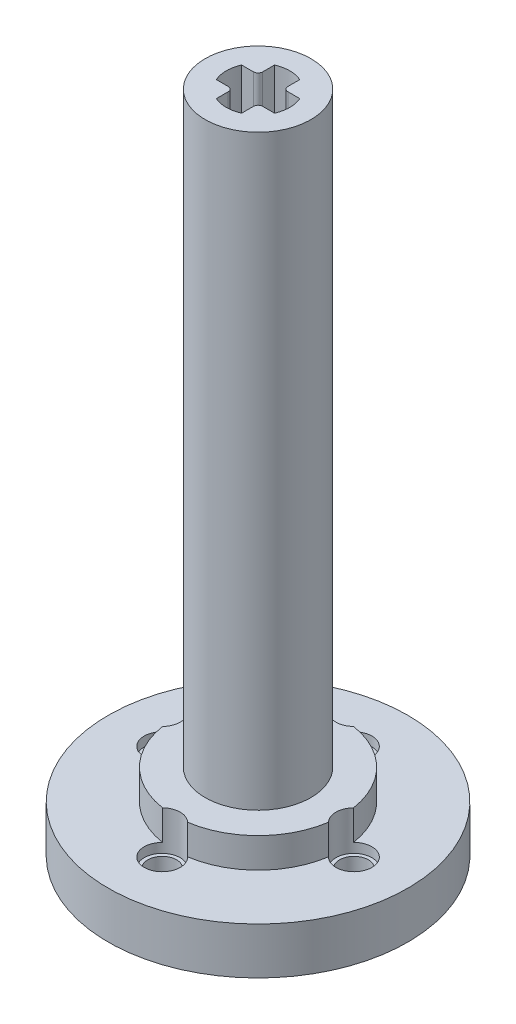
ISO-10303-21;
HEADER;
FILE_DESCRIPTION(('STEP AP214'),'2;1');
FILE_NAME('part.step','',(''),(''),'','','');
FILE_SCHEMA(('AUTOMOTIVE_DESIGN { 1 0 10303 214 1 1 1 1 }'));
ENDSEC;
DATA;
#1=APPLICATION_CONTEXT('core data for automotive mechanical design processes');
#2=APPLICATION_PROTOCOL_DEFINITION('international standard','automotive_design',2000,#1);
#3=PRODUCT_CONTEXT('',#1,'mechanical');
#4=PRODUCT('Part','Part','',(#3));
#5=PRODUCT_RELATED_PRODUCT_CATEGORY('part','',(#4));
#6=PRODUCT_DEFINITION_FORMATION('','',#4);
#7=PRODUCT_DEFINITION_CONTEXT('part definition',#1,'design');
#8=PRODUCT_DEFINITION('design','',#6,#7);
#9=PRODUCT_DEFINITION_SHAPE('','',#8);
#10=(LENGTH_UNIT() NAMED_UNIT(*) SI_UNIT(.MILLI.,.METRE.));
#11=(NAMED_UNIT(*) PLANE_ANGLE_UNIT() SI_UNIT($,.RADIAN.));
#12=(NAMED_UNIT(*) SI_UNIT($,.STERADIAN.) SOLID_ANGLE_UNIT());
#13=UNCERTAINTY_MEASURE_WITH_UNIT(LENGTH_MEASURE(1.E-05),#10,'distance_accuracy_value','');
#14=(GEOMETRIC_REPRESENTATION_CONTEXT(3) GLOBAL_UNCERTAINTY_ASSIGNED_CONTEXT((#13)) GLOBAL_UNIT_ASSIGNED_CONTEXT((#10,
#11,#12)) REPRESENTATION_CONTEXT('',''));
#15=CARTESIAN_POINT('',(0.,0.,0.));
#16=DIRECTION('',(0.,0.,1.));
#17=DIRECTION('',(1.,0.,0.));
#18=AXIS2_PLACEMENT_3D('',#15,#16,#17);
#19=CARTESIAN_POINT('',(0.,0.,0.));
#20=DIRECTION('',(0.,-1.,0.));
#21=DIRECTION('',(0.,0.,-1.));
#22=AXIS2_PLACEMENT_3D('',#19,#20,#21);
#23=CYLINDRICAL_SURFACE('',#22,7.);
#24=CARTESIAN_POINT('',(0.,3.9,0.));
#25=DIRECTION('',(0.,-1.,0.));
#26=DIRECTION('',(0.,0.,-1.));
#27=AXIS2_PLACEMENT_3D('',#24,#25,#26);
#28=CIRCLE('',#27,7.);
#29=CARTESIAN_POINT('',(1.04290291224783,3.9,-6.921875));
#30=VERTEX_POINT('',#29);
#31=CARTESIAN_POINT('',(6.921875,3.9,-1.04290291224782));
#32=VERTEX_POINT('',#31);
#33=EDGE_CURVE('E238',#30,#32,#28,.T.);
#34=ORIENTED_EDGE('',*,*,#33,.F.);
#35=DIRECTION('',(0.,-1.,0.));
#36=VECTOR('',#35,1.);
#37=CARTESIAN_POINT('',(1.04290291224783,4.753125,-6.921875));
#38=LINE('',#37,#36);
#39=CARTESIAN_POINT('',(1.04290291224783,6.4,-6.921875));
#40=VERTEX_POINT('',#39);
#41=EDGE_CURVE('E322',#30,#40,#38,.F.);
#42=ORIENTED_EDGE('',*,*,#41,.T.);
#43=CARTESIAN_POINT('',(0.,6.4,0.));
#44=DIRECTION('',(0.,-1.,0.));
#45=DIRECTION('',(0.,0.,-1.));
#46=AXIS2_PLACEMENT_3D('',#43,#44,#45);
#47=CIRCLE('',#46,7.);
#48=CARTESIAN_POINT('',(6.921875,6.4,-1.04290291224782));
#49=VERTEX_POINT('',#48);
#50=EDGE_CURVE('E228',#40,#49,#47,.T.);
#51=ORIENTED_EDGE('',*,*,#50,.T.);
#52=DIRECTION('',(0.,-1.,0.));
#53=VECTOR('',#52,1.);
#54=CARTESIAN_POINT('',(6.921875,4.753125,-1.04290291224782));
#55=LINE('',#54,#53);
#56=EDGE_CURVE('E205',#49,#32,#55,.T.);
#57=ORIENTED_EDGE('',*,*,#56,.T.);
#58=EDGE_LOOP('',(#34,#42,#51,#57));
#59=FACE_BOUND('',#58,.T.);
#60=ADVANCED_FACE('F39',(#59),#23,.T.);
#61=CARTESIAN_POINT('',(-6.921875,6.4,-1.04290291224782));
#62=VERTEX_POINT('',#61);
#63=CARTESIAN_POINT('',(-1.04290291224783,6.4,-6.921875));
#64=VERTEX_POINT('',#63);
#65=EDGE_CURVE('E232',#62,#64,#47,.T.);
#66=ORIENTED_EDGE('',*,*,#65,.T.);
#67=DIRECTION('',(0.,-1.,0.));
#68=VECTOR('',#67,1.);
#69=CARTESIAN_POINT('',(-1.04290291224783,4.753125,-6.921875));
#70=LINE('',#69,#68);
#71=CARTESIAN_POINT('',(-1.04290291224783,3.9,-6.921875));
#72=VERTEX_POINT('',#71);
#73=EDGE_CURVE('E54',#64,#72,#70,.T.);
#74=ORIENTED_EDGE('',*,*,#73,.T.);
#75=CARTESIAN_POINT('',(-6.921875,3.9,-1.04290291224782));
#76=VERTEX_POINT('',#75);
#77=EDGE_CURVE('E231',#76,#72,#28,.T.);
#78=ORIENTED_EDGE('',*,*,#77,.F.);
#79=DIRECTION('',(0.,-1.,0.));
#80=VECTOR('',#79,1.);
#81=CARTESIAN_POINT('',(-6.921875,4.753125,-1.04290291224782));
#82=LINE('',#81,#80);
#83=EDGE_CURVE('E316',#76,#62,#82,.F.);
#84=ORIENTED_EDGE('',*,*,#83,.T.);
#85=EDGE_LOOP('',(#66,#74,#78,#84));
#86=FACE_BOUND('',#85,.T.);
#87=ADVANCED_FACE('F263',(#86),#23,.T.);
#88=CARTESIAN_POINT('',(-1.04290291224783,6.4,6.921875));
#89=VERTEX_POINT('',#88);
#90=CARTESIAN_POINT('',(-6.921875,6.4,1.04290291224782));
#91=VERTEX_POINT('',#90);
#92=EDGE_CURVE('E229',#89,#91,#47,.T.);
#93=ORIENTED_EDGE('',*,*,#92,.T.);
#94=DIRECTION('',(0.,-1.,0.));
#95=VECTOR('',#94,1.);
#96=CARTESIAN_POINT('',(-6.921875,4.753125,1.04290291224783));
#97=LINE('',#96,#95);
#98=CARTESIAN_POINT('',(-6.921875,3.9,1.04290291224783));
#99=VERTEX_POINT('',#98);
#100=EDGE_CURVE('E61',#91,#99,#97,.T.);
#101=ORIENTED_EDGE('',*,*,#100,.T.);
#102=CARTESIAN_POINT('',(-1.04290291224783,3.9,6.921875));
#103=VERTEX_POINT('',#102);
#104=EDGE_CURVE('E460',#103,#99,#28,.T.);
#105=ORIENTED_EDGE('',*,*,#104,.F.);
#106=DIRECTION('',(0.,-1.,0.));
#107=VECTOR('',#106,1.);
#108=CARTESIAN_POINT('',(-1.04290291224783,4.753125,6.921875));
#109=LINE('',#108,#107);
#110=EDGE_CURVE('E286',#103,#89,#109,.F.);
#111=ORIENTED_EDGE('',*,*,#110,.T.);
#112=EDGE_LOOP('',(#93,#101,#105,#111));
#113=FACE_BOUND('',#112,.T.);
#114=ADVANCED_FACE('F270',(#113),#23,.T.);
#115=CARTESIAN_POINT('',(6.921875,6.4,1.04290291224783));
#116=VERTEX_POINT('',#115);
#117=CARTESIAN_POINT('',(1.04290291224783,6.4,6.921875));
#118=VERTEX_POINT('',#117);
#119=EDGE_CURVE('E218',#116,#118,#47,.T.);
#120=ORIENTED_EDGE('',*,*,#119,.T.);
#121=DIRECTION('',(0.,-1.,0.));
#122=VECTOR('',#121,1.);
#123=CARTESIAN_POINT('',(1.04290291224783,4.753125,6.921875));
#124=LINE('',#123,#122);
#125=CARTESIAN_POINT('',(1.04290291224783,3.9,6.921875));
#126=VERTEX_POINT('',#125);
#127=EDGE_CURVE('E221',#118,#126,#124,.T.);
#128=ORIENTED_EDGE('',*,*,#127,.T.);
#129=CARTESIAN_POINT('',(6.921875,3.9,1.04290291224782));
#130=VERTEX_POINT('',#129);
#131=EDGE_CURVE('E220',#130,#126,#28,.T.);
#132=ORIENTED_EDGE('',*,*,#131,.F.);
#133=DIRECTION('',(0.,-1.,0.));
#134=VECTOR('',#133,1.);
#135=CARTESIAN_POINT('',(6.921875,4.753125,1.04290291224783));
#136=LINE('',#135,#134);
#137=EDGE_CURVE('E202',#130,#116,#136,.F.);
#138=ORIENTED_EDGE('',*,*,#137,.T.);
#139=EDGE_LOOP('',(#120,#128,#132,#138));
#140=FACE_BOUND('',#139,.T.);
#141=ADVANCED_FACE('F216',(#140),#23,.T.);
#142=CARTESIAN_POINT('',(0.,0.,0.));
#143=DIRECTION('',(0.,-1.,0.));
#144=DIRECTION('',(0.,0.,-1.));
#145=AXIS2_PLACEMENT_3D('',#142,#143,#144);
#146=PLANE('',#145);
#147=CARTESIAN_POINT('',(8.,0.,0.));
#148=DIRECTION('',(0.,-1.,0.));
#149=DIRECTION('',(0.,0.,-1.));
#150=AXIS2_PLACEMENT_3D('',#147,#148,#149);
#151=CIRCLE('',#150,1.2);
#152=CARTESIAN_POINT('',(8.,0.,-1.2));
#153=VERTEX_POINT('',#152);
#154=EDGE_CURVE('E660',#153,#153,#151,.F.);
#155=ORIENTED_EDGE('',*,*,#154,.T.);
#156=EDGE_LOOP('',(#155));
#157=FACE_BOUND('',#156,.T.);
#158=CARTESIAN_POINT('',(0.,0.,-8.));
#159=DIRECTION('',(0.,-1.,0.));
#160=DIRECTION('',(0.,0.,-1.));
#161=AXIS2_PLACEMENT_3D('',#158,#159,#160);
#162=CIRCLE('',#161,1.2);
#163=CARTESIAN_POINT('',(0.,0.,-9.2));
#164=VERTEX_POINT('',#163);
#165=EDGE_CURVE('E667',#164,#164,#162,.F.);
#166=ORIENTED_EDGE('',*,*,#165,.T.);
#167=EDGE_LOOP('',(#166));
#168=FACE_BOUND('',#167,.T.);
#169=CARTESIAN_POINT('',(-8.,0.,0.));
#170=DIRECTION('',(0.,-1.,0.));
#171=DIRECTION('',(0.,0.,-1.));
#172=AXIS2_PLACEMENT_3D('',#169,#170,#171);
#173=CIRCLE('',#172,1.2);
#174=CARTESIAN_POINT('',(-8.,0.,-1.2));
#175=VERTEX_POINT('',#174);
#176=EDGE_CURVE('E672',#175,#175,#173,.F.);
#177=ORIENTED_EDGE('',*,*,#176,.T.);
#178=EDGE_LOOP('',(#177));
#179=FACE_BOUND('',#178,.T.);
#180=CARTESIAN_POINT('',(0.,0.,8.));
#181=DIRECTION('',(0.,-1.,0.));
#182=DIRECTION('',(0.,0.,-1.));
#183=AXIS2_PLACEMENT_3D('',#180,#181,#182);
#184=CIRCLE('',#183,1.2);
#185=CARTESIAN_POINT('',(0.,0.,6.8));
#186=VERTEX_POINT('',#185);
#187=EDGE_CURVE('E675',#186,#186,#184,.F.);
#188=ORIENTED_EDGE('',*,*,#187,.T.);
#189=EDGE_LOOP('',(#188));
#190=FACE_BOUND('',#189,.T.);
#191=CARTESIAN_POINT('',(0.,0.,0.));
#192=DIRECTION('',(0.,-1.,0.));
#193=DIRECTION('',(0.,0.,-1.));
#194=AXIS2_PLACEMENT_3D('',#191,#192,#193);
#195=CIRCLE('',#194,12.5);
#196=CARTESIAN_POINT('',(0.,0.,-12.5));
#197=VERTEX_POINT('',#196);
#198=EDGE_CURVE('E47',#197,#197,#195,.T.);
#199=ORIENTED_EDGE('',*,*,#198,.T.);
#200=EDGE_LOOP('',(#199));
#201=FACE_BOUND('',#200,.T.);
#202=CARTESIAN_POINT('',(1.435,0.,-1.435));
#203=DIRECTION('',(0.,-1.,0.));
#204=DIRECTION('',(0.,0.,-1.));
#205=AXIS2_PLACEMENT_3D('',#202,#203,#204);
#206=CIRCLE('',#205,0.38);
#207=CARTESIAN_POINT('',(1.055,0.,-1.435));
#208=VERTEX_POINT('',#207);
#209=CARTESIAN_POINT('',(1.435,0.,-1.055));
#210=VERTEX_POINT('',#209);
#211=EDGE_CURVE('E361',#208,#210,#206,.F.);
#212=ORIENTED_EDGE('',*,*,#211,.F.);
#213=DIRECTION('',(0.,0.,1.));
#214=VECTOR('',#213,1.);
#215=CARTESIAN_POINT('',(1.055,0.,0.));
#216=LINE('',#215,#214);
#217=CARTESIAN_POINT('',(1.055,0.,-2.43004155190476));
#218=VERTEX_POINT('',#217);
#219=EDGE_CURVE('E363',#218,#208,#216,.T.);
#220=ORIENTED_EDGE('',*,*,#219,.F.);
#221=CARTESIAN_POINT('',(0.,0.,0.));
#222=DIRECTION('',(0.,-1.,0.));
#223=DIRECTION('',(0.,0.,-1.));
#224=AXIS2_PLACEMENT_3D('',#221,#222,#223);
#225=CIRCLE('',#224,2.64917476659878);
#226=CARTESIAN_POINT('',(-1.055,0.,-2.43004155190476));
#227=VERTEX_POINT('',#226);
#228=EDGE_CURVE('E416',#218,#227,#225,.F.);
#229=ORIENTED_EDGE('',*,*,#228,.T.);
#230=DIRECTION('',(0.,0.,1.));
#231=VECTOR('',#230,1.);
#232=CARTESIAN_POINT('',(-1.055,0.,0.));
#233=LINE('',#232,#231);
#234=CARTESIAN_POINT('',(-1.055,0.,-1.435));
#235=VERTEX_POINT('',#234);
#236=EDGE_CURVE('E325',#227,#235,#233,.T.);
#237=ORIENTED_EDGE('',*,*,#236,.T.);
#238=CARTESIAN_POINT('',(-1.435,0.,-1.435));
#239=DIRECTION('',(0.,-1.,0.));
#240=DIRECTION('',(0.,0.,-1.));
#241=AXIS2_PLACEMENT_3D('',#238,#239,#240);
#242=CIRCLE('',#241,0.38);
#243=CARTESIAN_POINT('',(-1.435,0.,-1.055));
#244=VERTEX_POINT('',#243);
#245=EDGE_CURVE('E328',#235,#244,#242,.T.);
#246=ORIENTED_EDGE('',*,*,#245,.T.);
#247=DIRECTION('',(1.,0.,0.));
#248=VECTOR('',#247,1.);
#249=CARTESIAN_POINT('',(0.,0.,-1.055));
#250=LINE('',#249,#248);
#251=CARTESIAN_POINT('',(-2.43004155190476,0.,-1.055));
#252=VERTEX_POINT('',#251);
#253=EDGE_CURVE('E331',#252,#244,#250,.T.);
#254=ORIENTED_EDGE('',*,*,#253,.F.);
#255=CARTESIAN_POINT('',(0.,0.,0.));
#256=DIRECTION('',(0.,-1.,0.));
#257=DIRECTION('',(0.,0.,-1.));
#258=AXIS2_PLACEMENT_3D('',#255,#256,#257);
#259=CIRCLE('',#258,2.64917476659878);
#260=CARTESIAN_POINT('',(-2.43004155190476,0.,1.055));
#261=VERTEX_POINT('',#260);
#262=EDGE_CURVE('E333',#252,#261,#259,.F.);
#263=ORIENTED_EDGE('',*,*,#262,.T.);
#264=DIRECTION('',(1.,0.,0.));
#265=VECTOR('',#264,1.);
#266=CARTESIAN_POINT('',(0.,0.,1.055));
#267=LINE('',#266,#265);
#268=CARTESIAN_POINT('',(-1.435,0.,1.055));
#269=VERTEX_POINT('',#268);
#270=EDGE_CURVE('E336',#261,#269,#267,.T.);
#271=ORIENTED_EDGE('',*,*,#270,.T.);
#272=CARTESIAN_POINT('',(-1.435,0.,1.435));
#273=DIRECTION('',(0.,-1.,0.));
#274=DIRECTION('',(0.,0.,-1.));
#275=AXIS2_PLACEMENT_3D('',#272,#273,#274);
#276=CIRCLE('',#275,0.38);
#277=CARTESIAN_POINT('',(-1.055,0.,1.435));
#278=VERTEX_POINT('',#277);
#279=EDGE_CURVE('E339',#269,#278,#276,.T.);
#280=ORIENTED_EDGE('',*,*,#279,.T.);
#281=DIRECTION('',(0.,0.,1.));
#282=VECTOR('',#281,1.);
#283=CARTESIAN_POINT('',(-1.055,0.,0.));
#284=LINE('',#283,#282);
#285=CARTESIAN_POINT('',(-1.055,0.,2.43004155190476));
#286=VERTEX_POINT('',#285);
#287=EDGE_CURVE('E342',#278,#286,#284,.T.);
#288=ORIENTED_EDGE('',*,*,#287,.T.);
#289=CARTESIAN_POINT('',(0.,0.,0.));
#290=DIRECTION('',(0.,-1.,0.));
#291=DIRECTION('',(0.,0.,-1.));
#292=AXIS2_PLACEMENT_3D('',#289,#290,#291);
#293=CIRCLE('',#292,2.64917476659878);
#294=CARTESIAN_POINT('',(1.055,0.,2.43004155190476));
#295=VERTEX_POINT('',#294);
#296=EDGE_CURVE('E345',#286,#295,#293,.F.);
#297=ORIENTED_EDGE('',*,*,#296,.T.);
#298=DIRECTION('',(0.,0.,1.));
#299=VECTOR('',#298,1.);
#300=CARTESIAN_POINT('',(1.055,0.,0.));
#301=LINE('',#300,#299);
#302=CARTESIAN_POINT('',(1.055,0.,1.435));
#303=VERTEX_POINT('',#302);
#304=EDGE_CURVE('E348',#303,#295,#301,.T.);
#305=ORIENTED_EDGE('',*,*,#304,.F.);
#306=CARTESIAN_POINT('',(1.435,0.,1.435));
#307=DIRECTION('',(0.,-1.,0.));
#308=DIRECTION('',(0.,0.,-1.));
#309=AXIS2_PLACEMENT_3D('',#306,#307,#308);
#310=CIRCLE('',#309,0.38);
#311=CARTESIAN_POINT('',(1.435,0.,1.055));
#312=VERTEX_POINT('',#311);
#313=EDGE_CURVE('E350',#303,#312,#310,.T.);
#314=ORIENTED_EDGE('',*,*,#313,.T.);
#315=DIRECTION('',(1.,0.,0.));
#316=VECTOR('',#315,1.);
#317=CARTESIAN_POINT('',(0.,0.,1.055));
#318=LINE('',#317,#316);
#319=CARTESIAN_POINT('',(2.43004155190476,0.,1.055));
#320=VERTEX_POINT('',#319);
#321=EDGE_CURVE('E353',#312,#320,#318,.T.);
#322=ORIENTED_EDGE('',*,*,#321,.T.);
#323=CARTESIAN_POINT('',(0.,0.,0.));
#324=DIRECTION('',(0.,-1.,0.));
#325=DIRECTION('',(0.,0.,-1.));
#326=AXIS2_PLACEMENT_3D('',#323,#324,#325);
#327=CIRCLE('',#326,2.64917476659878);
#328=CARTESIAN_POINT('',(2.43004155190476,0.,-1.055));
#329=VERTEX_POINT('',#328);
#330=EDGE_CURVE('E356',#320,#329,#327,.F.);
#331=ORIENTED_EDGE('',*,*,#330,.T.);
#332=DIRECTION('',(1.,0.,0.));
#333=VECTOR('',#332,1.);
#334=CARTESIAN_POINT('',(0.,0.,-1.055));
#335=LINE('',#334,#333);
#336=EDGE_CURVE('E359',#210,#329,#335,.T.);
#337=ORIENTED_EDGE('',*,*,#336,.F.);
#338=EDGE_LOOP('',(#212,#220,#229,#237,#246,#254,#263,#271,#280,#288,#297,#305,#314,#322,#331,#337));
#339=FACE_BOUND('',#338,.T.);
#340=ADVANCED_FACE('F41',(#157,#168,#179,#190,#201,#339),#146,.T.);
#341=CARTESIAN_POINT('',(4.41,55.4,0.));
#342=DIRECTION('',(0.,1.,0.));
#343=DIRECTION('',(0.,0.,1.));
#344=AXIS2_PLACEMENT_3D('',#341,#342,#343);
#345=PLANE('',#344);
#346=CARTESIAN_POINT('',(0.,55.4,0.));
#347=DIRECTION('',(0.,-1.,0.));
#348=DIRECTION('',(0.,0.,-1.));
#349=AXIS2_PLACEMENT_3D('',#346,#347,#348);
#350=CIRCLE('',#349,4.41);
#351=CARTESIAN_POINT('',(0.,55.4,-4.41));
#352=VERTEX_POINT('',#351);
#353=EDGE_CURVE('E448',#352,#352,#350,.T.);
#354=ORIENTED_EDGE('',*,*,#353,.F.);
#355=EDGE_LOOP('',(#354));
#356=FACE_BOUND('',#355,.T.);
#357=CARTESIAN_POINT('',(0.,55.4,0.));
#358=DIRECTION('',(0.,1.,0.));
#359=DIRECTION('',(0.,0.,1.));
#360=AXIS2_PLACEMENT_3D('',#357,#358,#359);
#361=CIRCLE('',#360,2.64917476659878);
#362=CARTESIAN_POINT('',(1.055,55.4,-2.43004155190476));
#363=VERTEX_POINT('',#362);
#364=CARTESIAN_POINT('',(-1.055,55.4,-2.43004155190476));
#365=VERTEX_POINT('',#364);
#366=EDGE_CURVE('E368',#363,#365,#361,.T.);
#367=ORIENTED_EDGE('',*,*,#366,.F.);
#368=DIRECTION('',(0.,0.,1.));
#369=VECTOR('',#368,1.);
#370=CARTESIAN_POINT('',(1.055,55.4,0.));
#371=LINE('',#370,#369);
#372=CARTESIAN_POINT('',(1.055,55.4,-1.435));
#373=VERTEX_POINT('',#372);
#374=EDGE_CURVE('E365',#363,#373,#371,.T.);
#375=ORIENTED_EDGE('',*,*,#374,.T.);
#376=CARTESIAN_POINT('',(1.435,55.4,-1.435));
#377=DIRECTION('',(0.,1.,0.));
#378=DIRECTION('',(0.,0.,1.));
#379=AXIS2_PLACEMENT_3D('',#376,#377,#378);
#380=CIRCLE('',#379,0.38);
#381=CARTESIAN_POINT('',(1.435,55.4,-1.055));
#382=VERTEX_POINT('',#381);
#383=EDGE_CURVE('E410',#373,#382,#380,.T.);
#384=ORIENTED_EDGE('',*,*,#383,.T.);
#385=DIRECTION('',(1.,0.,0.));
#386=VECTOR('',#385,1.);
#387=CARTESIAN_POINT('',(0.,55.4,-1.055));
#388=LINE('',#387,#386);
#389=CARTESIAN_POINT('',(2.43004155190476,55.4,-1.055));
#390=VERTEX_POINT('',#389);
#391=EDGE_CURVE('E407',#382,#390,#388,.T.);
#392=ORIENTED_EDGE('',*,*,#391,.T.);
#393=CARTESIAN_POINT('',(0.,55.4,0.));
#394=DIRECTION('',(0.,1.,0.));
#395=DIRECTION('',(0.,0.,1.));
#396=AXIS2_PLACEMENT_3D('',#393,#394,#395);
#397=CIRCLE('',#396,2.64917476659878);
#398=CARTESIAN_POINT('',(2.43004155190476,55.4,1.055));
#399=VERTEX_POINT('',#398);
#400=EDGE_CURVE('E404',#399,#390,#397,.T.);
#401=ORIENTED_EDGE('',*,*,#400,.F.);
#402=DIRECTION('',(1.,0.,0.));
#403=VECTOR('',#402,1.);
#404=CARTESIAN_POINT('',(0.,55.4,1.055));
#405=LINE('',#404,#403);
#406=CARTESIAN_POINT('',(1.435,55.4,1.055));
#407=VERTEX_POINT('',#406);
#408=EDGE_CURVE('E401',#407,#399,#405,.T.);
#409=ORIENTED_EDGE('',*,*,#408,.F.);
#410=CARTESIAN_POINT('',(1.435,55.4,1.435));
#411=DIRECTION('',(0.,1.,0.));
#412=DIRECTION('',(0.,0.,1.));
#413=AXIS2_PLACEMENT_3D('',#410,#411,#412);
#414=CIRCLE('',#413,0.38);
#415=CARTESIAN_POINT('',(1.055,55.4,1.435));
#416=VERTEX_POINT('',#415);
#417=EDGE_CURVE('E398',#416,#407,#414,.F.);
#418=ORIENTED_EDGE('',*,*,#417,.F.);
#419=DIRECTION('',(0.,0.,1.));
#420=VECTOR('',#419,1.);
#421=CARTESIAN_POINT('',(1.055,55.4,0.));
#422=LINE('',#421,#420);
#423=CARTESIAN_POINT('',(1.055,55.4,2.43004155190476));
#424=VERTEX_POINT('',#423);
#425=EDGE_CURVE('E395',#416,#424,#422,.T.);
#426=ORIENTED_EDGE('',*,*,#425,.T.);
#427=CARTESIAN_POINT('',(0.,55.4,0.));
#428=DIRECTION('',(0.,1.,0.));
#429=DIRECTION('',(0.,0.,1.));
#430=AXIS2_PLACEMENT_3D('',#427,#428,#429);
#431=CIRCLE('',#430,2.64917476659878);
#432=CARTESIAN_POINT('',(-1.055,55.4,2.43004155190476));
#433=VERTEX_POINT('',#432);
#434=EDGE_CURVE('E392',#433,#424,#431,.T.);
#435=ORIENTED_EDGE('',*,*,#434,.F.);
#436=DIRECTION('',(0.,0.,1.));
#437=VECTOR('',#436,1.);
#438=CARTESIAN_POINT('',(-1.055,55.4,0.));
#439=LINE('',#438,#437);
#440=CARTESIAN_POINT('',(-1.055,55.4,1.435));
#441=VERTEX_POINT('',#440);
#442=EDGE_CURVE('E389',#441,#433,#439,.T.);
#443=ORIENTED_EDGE('',*,*,#442,.F.);
#444=CARTESIAN_POINT('',(-1.435,55.4,1.435));
#445=DIRECTION('',(0.,1.,0.));
#446=DIRECTION('',(0.,0.,1.));
#447=AXIS2_PLACEMENT_3D('',#444,#445,#446);
#448=CIRCLE('',#447,0.38);
#449=CARTESIAN_POINT('',(-1.435,55.4,1.055));
#450=VERTEX_POINT('',#449);
#451=EDGE_CURVE('E386',#450,#441,#448,.F.);
#452=ORIENTED_EDGE('',*,*,#451,.F.);
#453=DIRECTION('',(1.,0.,0.));
#454=VECTOR('',#453,1.);
#455=CARTESIAN_POINT('',(0.,55.4,1.055));
#456=LINE('',#455,#454);
#457=CARTESIAN_POINT('',(-2.43004155190476,55.4,1.055));
#458=VERTEX_POINT('',#457);
#459=EDGE_CURVE('E383',#458,#450,#456,.T.);
#460=ORIENTED_EDGE('',*,*,#459,.F.);
#461=CARTESIAN_POINT('',(0.,55.4,0.));
#462=DIRECTION('',(0.,1.,0.));
#463=DIRECTION('',(0.,0.,1.));
#464=AXIS2_PLACEMENT_3D('',#461,#462,#463);
#465=CIRCLE('',#464,2.64917476659878);
#466=CARTESIAN_POINT('',(-2.43004155190476,55.4,-1.055));
#467=VERTEX_POINT('',#466);
#468=EDGE_CURVE('E380',#467,#458,#465,.T.);
#469=ORIENTED_EDGE('',*,*,#468,.F.);
#470=DIRECTION('',(1.,0.,0.));
#471=VECTOR('',#470,1.);
#472=CARTESIAN_POINT('',(0.,55.4,-1.055));
#473=LINE('',#472,#471);
#474=CARTESIAN_POINT('',(-1.435,55.4,-1.055));
#475=VERTEX_POINT('',#474);
#476=EDGE_CURVE('E377',#467,#475,#473,.T.);
#477=ORIENTED_EDGE('',*,*,#476,.T.);
#478=CARTESIAN_POINT('',(-1.435,55.4,-1.435));
#479=DIRECTION('',(0.,1.,0.));
#480=DIRECTION('',(0.,0.,1.));
#481=AXIS2_PLACEMENT_3D('',#478,#479,#480);
#482=CIRCLE('',#481,0.38);
#483=CARTESIAN_POINT('',(-1.055,55.4,-1.435));
#484=VERTEX_POINT('',#483);
#485=EDGE_CURVE('E374',#484,#475,#482,.F.);
#486=ORIENTED_EDGE('',*,*,#485,.F.);
#487=DIRECTION('',(0.,0.,1.));
#488=VECTOR('',#487,1.);
#489=CARTESIAN_POINT('',(-1.055,55.4,0.));
#490=LINE('',#489,#488);
#491=EDGE_CURVE('E371',#365,#484,#490,.T.);
#492=ORIENTED_EDGE('',*,*,#491,.F.);
#493=EDGE_LOOP('',(#367,#375,#384,#392,#401,#409,#418,#426,#435,#443,#452,#460,#469,#477,#486,#492));
#494=FACE_BOUND('',#493,.T.);
#495=ADVANCED_FACE('F251',(#356,#494),#345,.T.);
#496=CARTESIAN_POINT('',(0.,0.,0.));
#497=DIRECTION('',(0.,-1.,0.));
#498=DIRECTION('',(0.,0.,-1.));
#499=AXIS2_PLACEMENT_3D('',#496,#497,#498);
#500=CYLINDRICAL_SURFACE('',#499,12.5);
#501=CARTESIAN_POINT('',(0.,3.9,0.));
#502=DIRECTION('',(0.,-1.,0.));
#503=DIRECTION('',(0.,0.,-1.));
#504=AXIS2_PLACEMENT_3D('',#501,#502,#503);
#505=CIRCLE('',#504,12.5);
#506=CARTESIAN_POINT('',(0.,3.9,-12.5));
#507=VERTEX_POINT('',#506);
#508=EDGE_CURVE('E241',#507,#507,#505,.T.);
#509=ORIENTED_EDGE('',*,*,#508,.T.);
#510=EDGE_LOOP('',(#509));
#511=FACE_BOUND('',#510,.T.);
#512=ORIENTED_EDGE('',*,*,#198,.F.);
#513=EDGE_LOOP('',(#512));
#514=FACE_BOUND('',#513,.T.);
#515=ADVANCED_FACE('F248',(#511,#514),#500,.T.);
#516=CARTESIAN_POINT('',(12.5,3.9,0.));
#517=DIRECTION('',(0.,1.,0.));
#518=DIRECTION('',(0.,0.,1.));
#519=AXIS2_PLACEMENT_3D('',#516,#517,#518);
#520=PLANE('',#519);
#521=ORIENTED_EDGE('',*,*,#77,.T.);
#522=CARTESIAN_POINT('',(0.,3.9,-8.));
#523=DIRECTION('',(0.,1.,0.));
#524=DIRECTION('',(0.,0.,1.));
#525=AXIS2_PLACEMENT_3D('',#522,#523,#524);
#526=CIRCLE('',#525,1.5);
#527=EDGE_CURVE('E319',#72,#30,#526,.F.);
#528=ORIENTED_EDGE('',*,*,#527,.T.);
#529=ORIENTED_EDGE('',*,*,#33,.T.);
#530=CARTESIAN_POINT('',(8.,3.9,0.));
#531=DIRECTION('',(0.,1.,0.));
#532=DIRECTION('',(0.,0.,1.));
#533=AXIS2_PLACEMENT_3D('',#530,#531,#532);
#534=CIRCLE('',#533,1.5);
#535=EDGE_CURVE('E222',#32,#130,#534,.F.);
#536=ORIENTED_EDGE('',*,*,#535,.T.);
#537=ORIENTED_EDGE('',*,*,#131,.T.);
#538=CARTESIAN_POINT('',(0.,3.9,8.));
#539=DIRECTION('',(0.,1.,0.));
#540=DIRECTION('',(0.,0.,1.));
#541=AXIS2_PLACEMENT_3D('',#538,#539,#540);
#542=CIRCLE('',#541,1.5);
#543=EDGE_CURVE('E308',#126,#103,#542,.F.);
#544=ORIENTED_EDGE('',*,*,#543,.T.);
#545=ORIENTED_EDGE('',*,*,#104,.T.);
#546=CARTESIAN_POINT('',(-8.,3.9,0.));
#547=DIRECTION('',(0.,1.,0.));
#548=DIRECTION('',(0.,0.,1.));
#549=AXIS2_PLACEMENT_3D('',#546,#547,#548);
#550=CIRCLE('',#549,1.5);
#551=EDGE_CURVE('E313',#99,#76,#550,.F.);
#552=ORIENTED_EDGE('',*,*,#551,.T.);
#553=EDGE_LOOP('',(#521,#528,#529,#536,#537,#544,#545,#552));
#554=FACE_BOUND('',#553,.T.);
#555=ORIENTED_EDGE('',*,*,#508,.F.);
#556=EDGE_LOOP('',(#555));
#557=FACE_BOUND('',#556,.T.);
#558=ADVANCED_FACE('F250',(#554,#557),#520,.T.);
#559=CARTESIAN_POINT('',(7.,6.4,0.));
#560=DIRECTION('',(0.,1.,0.));
#561=DIRECTION('',(0.,0.,1.));
#562=AXIS2_PLACEMENT_3D('',#559,#560,#561);
#563=PLANE('',#562);
#564=CARTESIAN_POINT('',(0.,6.4,0.));
#565=DIRECTION('',(0.,-1.,0.));
#566=DIRECTION('',(0.,0.,-1.));
#567=AXIS2_PLACEMENT_3D('',#564,#565,#566);
#568=CIRCLE('',#567,4.41);
#569=CARTESIAN_POINT('',(0.,6.4,-4.41));
#570=VERTEX_POINT('',#569);
#571=EDGE_CURVE('E236',#570,#570,#568,.T.);
#572=ORIENTED_EDGE('',*,*,#571,.T.);
#573=EDGE_LOOP('',(#572));
#574=FACE_BOUND('',#573,.T.);
#575=ORIENTED_EDGE('',*,*,#50,.F.);
#576=CARTESIAN_POINT('',(0.,6.4,-8.));
#577=DIRECTION('',(0.,1.,0.));
#578=DIRECTION('',(0.,0.,1.));
#579=AXIS2_PLACEMENT_3D('',#576,#577,#578);
#580=CIRCLE('',#579,1.5);
#581=EDGE_CURVE('E11',#40,#64,#580,.F.);
#582=ORIENTED_EDGE('',*,*,#581,.T.);
#583=ORIENTED_EDGE('',*,*,#65,.F.);
#584=CARTESIAN_POINT('',(-8.,6.4,0.));
#585=DIRECTION('',(0.,1.,0.));
#586=DIRECTION('',(0.,0.,1.));
#587=AXIS2_PLACEMENT_3D('',#584,#585,#586);
#588=CIRCLE('',#587,1.5);
#589=EDGE_CURVE('E288',#91,#62,#588,.T.);
#590=ORIENTED_EDGE('',*,*,#589,.F.);
#591=ORIENTED_EDGE('',*,*,#92,.F.);
#592=CARTESIAN_POINT('',(0.,6.4,8.));
#593=DIRECTION('',(0.,1.,0.));
#594=DIRECTION('',(0.,0.,1.));
#595=AXIS2_PLACEMENT_3D('',#592,#593,#594);
#596=CIRCLE('',#595,1.5);
#597=EDGE_CURVE('E227',#118,#89,#596,.T.);
#598=ORIENTED_EDGE('',*,*,#597,.F.);
#599=ORIENTED_EDGE('',*,*,#119,.F.);
#600=CARTESIAN_POINT('',(8.,6.4,0.));
#601=DIRECTION('',(0.,1.,0.));
#602=DIRECTION('',(0.,0.,1.));
#603=AXIS2_PLACEMENT_3D('',#600,#601,#602);
#604=CIRCLE('',#603,1.5);
#605=EDGE_CURVE('E198',#49,#116,#604,.T.);
#606=ORIENTED_EDGE('',*,*,#605,.F.);
#607=EDGE_LOOP('',(#575,#582,#583,#590,#591,#598,#599,#606));
#608=FACE_BOUND('',#607,.T.);
#609=ADVANCED_FACE('F225',(#574,#608),#563,.T.);
#610=CARTESIAN_POINT('',(0.,0.,0.));
#611=DIRECTION('',(0.,-1.,0.));
#612=DIRECTION('',(0.,0.,-1.));
#613=AXIS2_PLACEMENT_3D('',#610,#611,#612);
#614=CYLINDRICAL_SURFACE('',#613,4.41);
#615=ORIENTED_EDGE('',*,*,#353,.T.);
#616=EDGE_LOOP('',(#615));
#617=FACE_BOUND('',#616,.T.);
#618=ORIENTED_EDGE('',*,*,#571,.F.);
#619=EDGE_LOOP('',(#618));
#620=FACE_BOUND('',#619,.T.);
#621=ADVANCED_FACE('F563',(#617,#620),#614,.T.);
#622=CARTESIAN_POINT('',(1.055,-0.001000000000001,0.));
#623=DIRECTION('',(-1.,0.,0.));
#624=DIRECTION('',(0.,0.,1.));
#625=AXIS2_PLACEMENT_3D('',#622,#623,#624);
#626=PLANE('',#625);
#627=ORIENTED_EDGE('',*,*,#219,.T.);
#628=DIRECTION('',(0.,1.,0.));
#629=VECTOR('',#628,1.);
#630=CARTESIAN_POINT('',(1.055,-0.001000000000001,-1.435));
#631=LINE('',#630,#629);
#632=EDGE_CURVE('E414',#208,#373,#631,.T.);
#633=ORIENTED_EDGE('',*,*,#632,.T.);
#634=ORIENTED_EDGE('',*,*,#374,.F.);
#635=DIRECTION('',(0.,1.,0.));
#636=VECTOR('',#635,1.);
#637=CARTESIAN_POINT('',(1.055,-0.001000000000001,-2.43004155190476));
#638=LINE('',#637,#636);
#639=EDGE_CURVE('E413',#218,#363,#638,.T.);
#640=ORIENTED_EDGE('',*,*,#639,.F.);
#641=EDGE_LOOP('',(#627,#633,#634,#640));
#642=FACE_BOUND('',#641,.T.);
#643=ADVANCED_FACE('F507',(#642),#626,.T.);
#644=CARTESIAN_POINT('',(1.435,-0.001000000000001,-1.435));
#645=DIRECTION('',(0.,1.,0.));
#646=DIRECTION('',(0.,0.,1.));
#647=AXIS2_PLACEMENT_3D('',#644,#645,#646);
#648=CYLINDRICAL_SURFACE('',#647,0.38);
#649=ORIENTED_EDGE('',*,*,#211,.T.);
#650=DIRECTION('',(0.,1.,0.));
#651=VECTOR('',#650,1.);
#652=CARTESIAN_POINT('',(1.435,-0.001000000000001,-1.055));
#653=LINE('',#652,#651);
#654=EDGE_CURVE('E417',#210,#382,#653,.T.);
#655=ORIENTED_EDGE('',*,*,#654,.T.);
#656=ORIENTED_EDGE('',*,*,#383,.F.);
#657=ORIENTED_EDGE('',*,*,#632,.F.);
#658=EDGE_LOOP('',(#649,#655,#656,#657));
#659=FACE_BOUND('',#658,.T.);
#660=ADVANCED_FACE('F503',(#659),#648,.T.);
#661=CARTESIAN_POINT('',(0.,-0.001000000000001,-1.055));
#662=DIRECTION('',(0.,0.,1.));
#663=DIRECTION('',(1.,0.,0.));
#664=AXIS2_PLACEMENT_3D('',#661,#662,#663);
#665=PLANE('',#664);
#666=ORIENTED_EDGE('',*,*,#336,.T.);
#667=DIRECTION('',(0.,1.,0.));
#668=VECTOR('',#667,1.);
#669=CARTESIAN_POINT('',(2.43004155190476,-0.001000000000001,-1.055));
#670=LINE('',#669,#668);
#671=EDGE_CURVE('E419',#329,#390,#670,.T.);
#672=ORIENTED_EDGE('',*,*,#671,.T.);
#673=ORIENTED_EDGE('',*,*,#391,.F.);
#674=ORIENTED_EDGE('',*,*,#654,.F.);
#675=EDGE_LOOP('',(#666,#672,#673,#674));
#676=FACE_BOUND('',#675,.T.);
#677=ADVANCED_FACE('F506',(#676),#665,.T.);
#678=CARTESIAN_POINT('',(0.,-0.001000000000001,0.));
#679=DIRECTION('',(0.,1.,0.));
#680=DIRECTION('',(0.,0.,1.));
#681=AXIS2_PLACEMENT_3D('',#678,#679,#680);
#682=CYLINDRICAL_SURFACE('',#681,2.64917476659878);
#683=DIRECTION('',(0.,1.,0.));
#684=VECTOR('',#683,1.);
#685=CARTESIAN_POINT('',(2.43004155190476,-0.001000000000001,1.055));
#686=LINE('',#685,#684);
#687=EDGE_CURVE('E421',#320,#399,#686,.T.);
#688=ORIENTED_EDGE('',*,*,#687,.T.);
#689=ORIENTED_EDGE('',*,*,#400,.T.);
#690=ORIENTED_EDGE('',*,*,#671,.F.);
#691=ORIENTED_EDGE('',*,*,#330,.F.);
#692=EDGE_LOOP('',(#688,#689,#690,#691));
#693=FACE_BOUND('',#692,.T.);
#694=ADVANCED_FACE('F511',(#693),#682,.F.);
#695=CARTESIAN_POINT('',(0.,-0.001000000000001,1.055));
#696=DIRECTION('',(0.,0.,1.));
#697=DIRECTION('',(1.,0.,0.));
#698=AXIS2_PLACEMENT_3D('',#695,#696,#697);
#699=PLANE('',#698);
#700=DIRECTION('',(0.,1.,0.));
#701=VECTOR('',#700,1.);
#702=CARTESIAN_POINT('',(1.435,-0.001000000000001,1.055));
#703=LINE('',#702,#701);
#704=EDGE_CURVE('E423',#312,#407,#703,.T.);
#705=ORIENTED_EDGE('',*,*,#704,.T.);
#706=ORIENTED_EDGE('',*,*,#408,.T.);
#707=ORIENTED_EDGE('',*,*,#687,.F.);
#708=ORIENTED_EDGE('',*,*,#321,.F.);
#709=EDGE_LOOP('',(#705,#706,#707,#708));
#710=FACE_BOUND('',#709,.T.);
#711=ADVANCED_FACE('F515',(#710),#699,.F.);
#712=CARTESIAN_POINT('',(1.435,-0.001000000000001,1.435));
#713=DIRECTION('',(0.,1.,0.));
#714=DIRECTION('',(0.,0.,1.));
#715=AXIS2_PLACEMENT_3D('',#712,#713,#714);
#716=CYLINDRICAL_SURFACE('',#715,0.38);
#717=DIRECTION('',(0.,1.,0.));
#718=VECTOR('',#717,1.);
#719=CARTESIAN_POINT('',(1.055,-0.001000000000001,1.435));
#720=LINE('',#719,#718);
#721=EDGE_CURVE('E425',#303,#416,#720,.T.);
#722=ORIENTED_EDGE('',*,*,#721,.T.);
#723=ORIENTED_EDGE('',*,*,#417,.T.);
#724=ORIENTED_EDGE('',*,*,#704,.F.);
#725=ORIENTED_EDGE('',*,*,#313,.F.);
#726=EDGE_LOOP('',(#722,#723,#724,#725));
#727=FACE_BOUND('',#726,.T.);
#728=ADVANCED_FACE('F519',(#727),#716,.T.);
#729=CARTESIAN_POINT('',(1.055,-0.001000000000001,0.));
#730=DIRECTION('',(-1.,0.,0.));
#731=DIRECTION('',(0.,0.,1.));
#732=AXIS2_PLACEMENT_3D('',#729,#730,#731);
#733=PLANE('',#732);
#734=ORIENTED_EDGE('',*,*,#304,.T.);
#735=DIRECTION('',(0.,1.,0.));
#736=VECTOR('',#735,1.);
#737=CARTESIAN_POINT('',(1.055,-0.001000000000001,2.43004155190476));
#738=LINE('',#737,#736);
#739=EDGE_CURVE('E427',#295,#424,#738,.T.);
#740=ORIENTED_EDGE('',*,*,#739,.T.);
#741=ORIENTED_EDGE('',*,*,#425,.F.);
#742=ORIENTED_EDGE('',*,*,#721,.F.);
#743=EDGE_LOOP('',(#734,#740,#741,#742));
#744=FACE_BOUND('',#743,.T.);
#745=ADVANCED_FACE('F523',(#744),#733,.T.);
#746=CARTESIAN_POINT('',(0.,-0.001000000000001,0.));
#747=DIRECTION('',(0.,1.,0.));
#748=DIRECTION('',(0.,0.,1.));
#749=AXIS2_PLACEMENT_3D('',#746,#747,#748);
#750=CYLINDRICAL_SURFACE('',#749,2.64917476659878);
#751=DIRECTION('',(0.,1.,0.));
#752=VECTOR('',#751,1.);
#753=CARTESIAN_POINT('',(-1.055,-0.001000000000001,2.43004155190476));
#754=LINE('',#753,#752);
#755=EDGE_CURVE('E429',#286,#433,#754,.T.);
#756=ORIENTED_EDGE('',*,*,#755,.T.);
#757=ORIENTED_EDGE('',*,*,#434,.T.);
#758=ORIENTED_EDGE('',*,*,#739,.F.);
#759=ORIENTED_EDGE('',*,*,#296,.F.);
#760=EDGE_LOOP('',(#756,#757,#758,#759));
#761=FACE_BOUND('',#760,.T.);
#762=ADVANCED_FACE('F527',(#761),#750,.F.);
#763=CARTESIAN_POINT('',(-1.055,-0.001000000000001,0.));
#764=DIRECTION('',(-1.,0.,0.));
#765=DIRECTION('',(0.,0.,1.));
#766=AXIS2_PLACEMENT_3D('',#763,#764,#765);
#767=PLANE('',#766);
#768=DIRECTION('',(0.,1.,0.));
#769=VECTOR('',#768,1.);
#770=CARTESIAN_POINT('',(-1.055,-0.001000000000001,1.435));
#771=LINE('',#770,#769);
#772=EDGE_CURVE('E431',#278,#441,#771,.T.);
#773=ORIENTED_EDGE('',*,*,#772,.T.);
#774=ORIENTED_EDGE('',*,*,#442,.T.);
#775=ORIENTED_EDGE('',*,*,#755,.F.);
#776=ORIENTED_EDGE('',*,*,#287,.F.);
#777=EDGE_LOOP('',(#773,#774,#775,#776));
#778=FACE_BOUND('',#777,.T.);
#779=ADVANCED_FACE('F531',(#778),#767,.F.);
#780=CARTESIAN_POINT('',(-1.435,-0.001000000000001,1.435));
#781=DIRECTION('',(0.,1.,0.));
#782=DIRECTION('',(0.,0.,1.));
#783=AXIS2_PLACEMENT_3D('',#780,#781,#782);
#784=CYLINDRICAL_SURFACE('',#783,0.38);
#785=DIRECTION('',(0.,1.,0.));
#786=VECTOR('',#785,1.);
#787=CARTESIAN_POINT('',(-1.435,-0.001000000000001,1.055));
#788=LINE('',#787,#786);
#789=EDGE_CURVE('E433',#269,#450,#788,.T.);
#790=ORIENTED_EDGE('',*,*,#789,.T.);
#791=ORIENTED_EDGE('',*,*,#451,.T.);
#792=ORIENTED_EDGE('',*,*,#772,.F.);
#793=ORIENTED_EDGE('',*,*,#279,.F.);
#794=EDGE_LOOP('',(#790,#791,#792,#793));
#795=FACE_BOUND('',#794,.T.);
#796=ADVANCED_FACE('F535',(#795),#784,.T.);
#797=CARTESIAN_POINT('',(0.,-0.001000000000001,1.055));
#798=DIRECTION('',(0.,0.,1.));
#799=DIRECTION('',(1.,0.,0.));
#800=AXIS2_PLACEMENT_3D('',#797,#798,#799);
#801=PLANE('',#800);
#802=DIRECTION('',(0.,1.,0.));
#803=VECTOR('',#802,1.);
#804=CARTESIAN_POINT('',(-2.43004155190476,-0.001000000000001,1.055));
#805=LINE('',#804,#803);
#806=EDGE_CURVE('E435',#261,#458,#805,.T.);
#807=ORIENTED_EDGE('',*,*,#806,.T.);
#808=ORIENTED_EDGE('',*,*,#459,.T.);
#809=ORIENTED_EDGE('',*,*,#789,.F.);
#810=ORIENTED_EDGE('',*,*,#270,.F.);
#811=EDGE_LOOP('',(#807,#808,#809,#810));
#812=FACE_BOUND('',#811,.T.);
#813=ADVANCED_FACE('F539',(#812),#801,.F.);
#814=CARTESIAN_POINT('',(0.,-0.001000000000001,0.));
#815=DIRECTION('',(0.,1.,0.));
#816=DIRECTION('',(0.,0.,1.));
#817=AXIS2_PLACEMENT_3D('',#814,#815,#816);
#818=CYLINDRICAL_SURFACE('',#817,2.64917476659878);
#819=DIRECTION('',(0.,1.,0.));
#820=VECTOR('',#819,1.);
#821=CARTESIAN_POINT('',(-2.43004155190476,-0.001000000000001,-1.055));
#822=LINE('',#821,#820);
#823=EDGE_CURVE('E437',#252,#467,#822,.T.);
#824=ORIENTED_EDGE('',*,*,#823,.T.);
#825=ORIENTED_EDGE('',*,*,#468,.T.);
#826=ORIENTED_EDGE('',*,*,#806,.F.);
#827=ORIENTED_EDGE('',*,*,#262,.F.);
#828=EDGE_LOOP('',(#824,#825,#826,#827));
#829=FACE_BOUND('',#828,.T.);
#830=ADVANCED_FACE('F543',(#829),#818,.F.);
#831=CARTESIAN_POINT('',(0.,-0.001000000000001,-1.055));
#832=DIRECTION('',(0.,0.,1.));
#833=DIRECTION('',(1.,0.,0.));
#834=AXIS2_PLACEMENT_3D('',#831,#832,#833);
#835=PLANE('',#834);
#836=ORIENTED_EDGE('',*,*,#253,.T.);
#837=DIRECTION('',(0.,1.,0.));
#838=VECTOR('',#837,1.);
#839=CARTESIAN_POINT('',(-1.435,-0.001000000000001,-1.055));
#840=LINE('',#839,#838);
#841=EDGE_CURVE('E439',#244,#475,#840,.T.);
#842=ORIENTED_EDGE('',*,*,#841,.T.);
#843=ORIENTED_EDGE('',*,*,#476,.F.);
#844=ORIENTED_EDGE('',*,*,#823,.F.);
#845=EDGE_LOOP('',(#836,#842,#843,#844));
#846=FACE_BOUND('',#845,.T.);
#847=ADVANCED_FACE('F547',(#846),#835,.T.);
#848=CARTESIAN_POINT('',(-1.435,-0.001000000000001,-1.435));
#849=DIRECTION('',(0.,1.,0.));
#850=DIRECTION('',(0.,0.,1.));
#851=AXIS2_PLACEMENT_3D('',#848,#849,#850);
#852=CYLINDRICAL_SURFACE('',#851,0.38);
#853=DIRECTION('',(0.,1.,0.));
#854=VECTOR('',#853,1.);
#855=CARTESIAN_POINT('',(-1.055,-0.001000000000001,-1.435));
#856=LINE('',#855,#854);
#857=EDGE_CURVE('E441',#235,#484,#856,.T.);
#858=ORIENTED_EDGE('',*,*,#857,.T.);
#859=ORIENTED_EDGE('',*,*,#485,.T.);
#860=ORIENTED_EDGE('',*,*,#841,.F.);
#861=ORIENTED_EDGE('',*,*,#245,.F.);
#862=EDGE_LOOP('',(#858,#859,#860,#861));
#863=FACE_BOUND('',#862,.T.);
#864=ADVANCED_FACE('F551',(#863),#852,.T.);
#865=CARTESIAN_POINT('',(-1.055,-0.001000000000001,0.));
#866=DIRECTION('',(-1.,0.,0.));
#867=DIRECTION('',(0.,0.,1.));
#868=AXIS2_PLACEMENT_3D('',#865,#866,#867);
#869=PLANE('',#868);
#870=DIRECTION('',(0.,1.,0.));
#871=VECTOR('',#870,1.);
#872=CARTESIAN_POINT('',(-1.055,-0.001000000000001,-2.43004155190476));
#873=LINE('',#872,#871);
#874=EDGE_CURVE('E443',#227,#365,#873,.T.);
#875=ORIENTED_EDGE('',*,*,#874,.T.);
#876=ORIENTED_EDGE('',*,*,#491,.T.);
#877=ORIENTED_EDGE('',*,*,#857,.F.);
#878=ORIENTED_EDGE('',*,*,#236,.F.);
#879=EDGE_LOOP('',(#875,#876,#877,#878));
#880=FACE_BOUND('',#879,.T.);
#881=ADVANCED_FACE('F555',(#880),#869,.F.);
#882=CARTESIAN_POINT('',(0.,-0.001000000000001,0.));
#883=DIRECTION('',(0.,1.,0.));
#884=DIRECTION('',(0.,0.,1.));
#885=AXIS2_PLACEMENT_3D('',#882,#883,#884);
#886=CYLINDRICAL_SURFACE('',#885,2.64917476659878);
#887=ORIENTED_EDGE('',*,*,#639,.T.);
#888=ORIENTED_EDGE('',*,*,#366,.T.);
#889=ORIENTED_EDGE('',*,*,#874,.F.);
#890=ORIENTED_EDGE('',*,*,#228,.F.);
#891=EDGE_LOOP('',(#887,#888,#889,#890));
#892=FACE_BOUND('',#891,.T.);
#893=ADVANCED_FACE('F499',(#892),#886,.F.);
#894=CARTESIAN_POINT('',(8.,10.6426406871193,0.));
#895=DIRECTION('',(0.,-1.,0.));
#896=DIRECTION('',(0.,0.,-1.));
#897=AXIS2_PLACEMENT_3D('',#894,#895,#896);
#898=CYLINDRICAL_SURFACE('',#897,1.5);
#899=ORIENTED_EDGE('',*,*,#535,.F.);
#900=ORIENTED_EDGE('',*,*,#56,.F.);
#901=ORIENTED_EDGE('',*,*,#605,.T.);
#902=ORIENTED_EDGE('',*,*,#137,.F.);
#903=EDGE_LOOP('',(#899,#900,#901,#902));
#904=FACE_BOUND('',#903,.T.);
#905=CARTESIAN_POINT('',(8.,3.10625,0.));
#906=DIRECTION('',(0.,1.,0.));
#907=DIRECTION('',(0.,0.,-1.));
#908=AXIS2_PLACEMENT_3D('',#905,#906,#907);
#909=CIRCLE('',#908,1.5);
#910=CARTESIAN_POINT('',(8.,3.10625,-1.5));
#911=VERTEX_POINT('',#910);
#912=EDGE_CURVE('E210',#911,#911,#909,.T.);
#913=ORIENTED_EDGE('',*,*,#912,.F.);
#914=EDGE_LOOP('',(#913));
#915=FACE_BOUND('',#914,.T.);
#916=ADVANCED_FACE('F200',(#904,#915),#898,.F.);
#917=CARTESIAN_POINT('',(8.,3.10625,0.));
#918=DIRECTION('',(0.,-1.,0.));
#919=DIRECTION('',(0.,0.,-1.));
#920=AXIS2_PLACEMENT_3D('',#917,#918,#919);
#921=PLANE('',#920);
#922=CARTESIAN_POINT('',(8.,3.10625,0.));
#923=DIRECTION('',(0.,-1.,0.));
#924=DIRECTION('',(0.,0.,-1.));
#925=AXIS2_PLACEMENT_3D('',#922,#923,#924);
#926=CIRCLE('',#925,1.2);
#927=CARTESIAN_POINT('',(8.,3.10625,-1.2));
#928=VERTEX_POINT('',#927);
#929=EDGE_CURVE('E211',#928,#928,#926,.F.);
#930=ORIENTED_EDGE('',*,*,#929,.F.);
#931=EDGE_LOOP('',(#930));
#932=FACE_BOUND('',#931,.T.);
#933=ORIENTED_EDGE('',*,*,#912,.T.);
#934=EDGE_LOOP('',(#933));
#935=FACE_BOUND('',#934,.T.);
#936=ADVANCED_FACE('F492',(#932,#935),#921,.F.);
#937=CARTESIAN_POINT('',(0.,10.6426406871193,8.));
#938=DIRECTION('',(0.,-1.,0.));
#939=DIRECTION('',(0.,0.,-1.));
#940=AXIS2_PLACEMENT_3D('',#937,#938,#939);
#941=CYLINDRICAL_SURFACE('',#940,1.5);
#942=ORIENTED_EDGE('',*,*,#543,.F.);
#943=ORIENTED_EDGE('',*,*,#127,.F.);
#944=ORIENTED_EDGE('',*,*,#597,.T.);
#945=ORIENTED_EDGE('',*,*,#110,.F.);
#946=EDGE_LOOP('',(#942,#943,#944,#945));
#947=FACE_BOUND('',#946,.T.);
#948=CARTESIAN_POINT('',(0.,3.10625,8.));
#949=DIRECTION('',(0.,1.,0.));
#950=DIRECTION('',(0.,0.,-1.));
#951=AXIS2_PLACEMENT_3D('',#948,#949,#950);
#952=CIRCLE('',#951,1.5);
#953=CARTESIAN_POINT('',(0.,3.10625,6.5));
#954=VERTEX_POINT('',#953);
#955=EDGE_CURVE('E292',#954,#954,#952,.T.);
#956=ORIENTED_EDGE('',*,*,#955,.F.);
#957=EDGE_LOOP('',(#956));
#958=FACE_BOUND('',#957,.T.);
#959=ADVANCED_FACE('F489',(#947,#958),#941,.F.);
#960=CARTESIAN_POINT('',(0.,3.10625,8.));
#961=DIRECTION('',(0.,-1.,0.));
#962=DIRECTION('',(0.,0.,-1.));
#963=AXIS2_PLACEMENT_3D('',#960,#961,#962);
#964=PLANE('',#963);
#965=CARTESIAN_POINT('',(0.,3.10625,8.));
#966=DIRECTION('',(0.,-1.,0.));
#967=DIRECTION('',(0.,0.,-1.));
#968=AXIS2_PLACEMENT_3D('',#965,#966,#967);
#969=CIRCLE('',#968,1.2);
#970=CARTESIAN_POINT('',(0.,3.10625,6.8));
#971=VERTEX_POINT('',#970);
#972=EDGE_CURVE('E679',#971,#971,#969,.F.);
#973=ORIENTED_EDGE('',*,*,#972,.F.);
#974=EDGE_LOOP('',(#973));
#975=FACE_BOUND('',#974,.T.);
#976=ORIENTED_EDGE('',*,*,#955,.T.);
#977=EDGE_LOOP('',(#976));
#978=FACE_BOUND('',#977,.T.);
#979=ADVANCED_FACE('F486',(#975,#978),#964,.F.);
#980=CARTESIAN_POINT('',(-8.,10.6426406871193,0.));
#981=DIRECTION('',(0.,-1.,0.));
#982=DIRECTION('',(0.,0.,-1.));
#983=AXIS2_PLACEMENT_3D('',#980,#981,#982);
#984=CYLINDRICAL_SURFACE('',#983,1.5);
#985=ORIENTED_EDGE('',*,*,#551,.F.);
#986=ORIENTED_EDGE('',*,*,#100,.F.);
#987=ORIENTED_EDGE('',*,*,#589,.T.);
#988=ORIENTED_EDGE('',*,*,#83,.F.);
#989=EDGE_LOOP('',(#985,#986,#987,#988));
#990=FACE_BOUND('',#989,.T.);
#991=CARTESIAN_POINT('',(-8.,3.10625,0.));
#992=DIRECTION('',(0.,1.,0.));
#993=DIRECTION('',(0.,0.,1.));
#994=AXIS2_PLACEMENT_3D('',#991,#992,#993);
#995=CIRCLE('',#994,1.5);
#996=CARTESIAN_POINT('',(-8.,3.10625,1.5));
#997=VERTEX_POINT('',#996);
#998=EDGE_CURVE('E291',#997,#997,#995,.T.);
#999=ORIENTED_EDGE('',*,*,#998,.F.);
#1000=EDGE_LOOP('',(#999));
#1001=FACE_BOUND('',#1000,.T.);
#1002=ADVANCED_FACE('F457',(#990,#1001),#984,.F.);
#1003=CARTESIAN_POINT('',(-8.,3.10625,0.));
#1004=DIRECTION('',(0.,1.,0.));
#1005=DIRECTION('',(0.,0.,1.));
#1006=AXIS2_PLACEMENT_3D('',#1003,#1004,#1005);
#1007=PLANE('',#1006);
#1008=CARTESIAN_POINT('',(-8.,3.10625,0.));
#1009=DIRECTION('',(0.,1.,0.));
#1010=DIRECTION('',(0.,0.,1.));
#1011=AXIS2_PLACEMENT_3D('',#1008,#1009,#1010);
#1012=CIRCLE('',#1011,1.2);
#1013=CARTESIAN_POINT('',(-8.,3.10625,1.2));
#1014=VERTEX_POINT('',#1013);
#1015=EDGE_CURVE('E670',#1014,#1014,#1012,.F.);
#1016=ORIENTED_EDGE('',*,*,#1015,.T.);
#1017=EDGE_LOOP('',(#1016));
#1018=FACE_BOUND('',#1017,.T.);
#1019=ORIENTED_EDGE('',*,*,#998,.T.);
#1020=EDGE_LOOP('',(#1019));
#1021=FACE_BOUND('',#1020,.T.);
#1022=ADVANCED_FACE('F465',(#1018,#1021),#1007,.T.);
#1023=CARTESIAN_POINT('',(0.,10.6426406871193,-8.));
#1024=DIRECTION('',(0.,-1.,0.));
#1025=DIRECTION('',(0.,0.,-1.));
#1026=AXIS2_PLACEMENT_3D('',#1023,#1024,#1025);
#1027=CYLINDRICAL_SURFACE('',#1026,1.5);
#1028=ORIENTED_EDGE('',*,*,#527,.F.);
#1029=ORIENTED_EDGE('',*,*,#73,.F.);
#1030=ORIENTED_EDGE('',*,*,#581,.F.);
#1031=ORIENTED_EDGE('',*,*,#41,.F.);
#1032=EDGE_LOOP('',(#1028,#1029,#1030,#1031));
#1033=FACE_BOUND('',#1032,.T.);
#1034=CARTESIAN_POINT('',(0.,3.10625,-8.));
#1035=DIRECTION('',(0.,1.,0.));
#1036=DIRECTION('',(0.,0.,1.));
#1037=AXIS2_PLACEMENT_3D('',#1034,#1035,#1036);
#1038=CIRCLE('',#1037,1.5);
#1039=CARTESIAN_POINT('',(0.,3.10625,-6.5));
#1040=VERTEX_POINT('',#1039);
#1041=EDGE_CURVE('E295',#1040,#1040,#1038,.T.);
#1042=ORIENTED_EDGE('',*,*,#1041,.F.);
#1043=EDGE_LOOP('',(#1042));
#1044=FACE_BOUND('',#1043,.T.);
#1045=ADVANCED_FACE('F461',(#1033,#1044),#1027,.F.);
#1046=CARTESIAN_POINT('',(0.,3.10625,-8.));
#1047=DIRECTION('',(0.,1.,0.));
#1048=DIRECTION('',(0.,0.,1.));
#1049=AXIS2_PLACEMENT_3D('',#1046,#1047,#1048);
#1050=PLANE('',#1049);
#1051=CARTESIAN_POINT('',(0.,3.10625,-8.));
#1052=DIRECTION('',(0.,1.,0.));
#1053=DIRECTION('',(0.,0.,1.));
#1054=AXIS2_PLACEMENT_3D('',#1051,#1052,#1053);
#1055=CIRCLE('',#1054,1.2);
#1056=CARTESIAN_POINT('',(0.,3.10625,-6.8));
#1057=VERTEX_POINT('',#1056);
#1058=EDGE_CURVE('E664',#1057,#1057,#1055,.F.);
#1059=ORIENTED_EDGE('',*,*,#1058,.T.);
#1060=EDGE_LOOP('',(#1059));
#1061=FACE_BOUND('',#1060,.T.);
#1062=ORIENTED_EDGE('',*,*,#1041,.T.);
#1063=EDGE_LOOP('',(#1062));
#1064=FACE_BOUND('',#1063,.T.);
#1065=ADVANCED_FACE('F464',(#1061,#1064),#1050,.T.);
#1066=CARTESIAN_POINT('',(0.,-0.00100000000000013,8.));
#1067=DIRECTION('',(0.,1.,0.));
#1068=DIRECTION('',(0.,0.,1.));
#1069=AXIS2_PLACEMENT_3D('',#1066,#1067,#1068);
#1070=CYLINDRICAL_SURFACE('',#1069,1.2);
#1071=ORIENTED_EDGE('',*,*,#187,.F.);
#1072=EDGE_LOOP('',(#1071));
#1073=FACE_BOUND('',#1072,.T.);
#1074=ORIENTED_EDGE('',*,*,#972,.T.);
#1075=EDGE_LOOP('',(#1074));
#1076=FACE_BOUND('',#1075,.T.);
#1077=ADVANCED_FACE('F471',(#1073,#1076),#1070,.F.);
#1078=CARTESIAN_POINT('',(-8.,-0.00100000000000013,0.));
#1079=DIRECTION('',(0.,1.,0.));
#1080=DIRECTION('',(0.,0.,1.));
#1081=AXIS2_PLACEMENT_3D('',#1078,#1079,#1080);
#1082=CYLINDRICAL_SURFACE('',#1081,1.2);
#1083=ORIENTED_EDGE('',*,*,#176,.F.);
#1084=EDGE_LOOP('',(#1083));
#1085=FACE_BOUND('',#1084,.T.);
#1086=ORIENTED_EDGE('',*,*,#1015,.F.);
#1087=EDGE_LOOP('',(#1086));
#1088=FACE_BOUND('',#1087,.T.);
#1089=ADVANCED_FACE('F478',(#1085,#1088),#1082,.F.);
#1090=CARTESIAN_POINT('',(0.,-0.00100000000000013,-8.));
#1091=DIRECTION('',(0.,1.,0.));
#1092=DIRECTION('',(0.,0.,1.));
#1093=AXIS2_PLACEMENT_3D('',#1090,#1091,#1092);
#1094=CYLINDRICAL_SURFACE('',#1093,1.2);
#1095=ORIENTED_EDGE('',*,*,#165,.F.);
#1096=EDGE_LOOP('',(#1095));
#1097=FACE_BOUND('',#1096,.T.);
#1098=ORIENTED_EDGE('',*,*,#1058,.F.);
#1099=EDGE_LOOP('',(#1098));
#1100=FACE_BOUND('',#1099,.T.);
#1101=ADVANCED_FACE('F633',(#1097,#1100),#1094,.F.);
#1102=CARTESIAN_POINT('',(8.,-0.00100000000000013,0.));
#1103=DIRECTION('',(0.,1.,0.));
#1104=DIRECTION('',(0.,0.,1.));
#1105=AXIS2_PLACEMENT_3D('',#1102,#1103,#1104);
#1106=CYLINDRICAL_SURFACE('',#1105,1.2);
#1107=ORIENTED_EDGE('',*,*,#154,.F.);
#1108=EDGE_LOOP('',(#1107));
#1109=FACE_BOUND('',#1108,.T.);
#1110=ORIENTED_EDGE('',*,*,#929,.T.);
#1111=EDGE_LOOP('',(#1110));
#1112=FACE_BOUND('',#1111,.T.);
#1113=ADVANCED_FACE('F641',(#1109,#1112),#1106,.F.);
#1114=CLOSED_SHELL('',(#60,#87,#114,#141,#340,#495,#515,#558,#609,#621,#643,#660,#677,#694,#711,
#728,#745,#762,#779,#796,#813,#830,#847,#864,#881,#893,#916,#936,#959,#979,#1002,#1022,#1045,
#1065,#1077,#1089,#1101,#1113));
#1115=MANIFOLD_SOLID_BREP('B2',#1114);
#1116=ADVANCED_BREP_SHAPE_REPRESENTATION('',(#18,#1115),#14);
#1117=SHAPE_DEFINITION_REPRESENTATION(#9,#1116);
ENDSEC;
END-ISO-10303-21;
